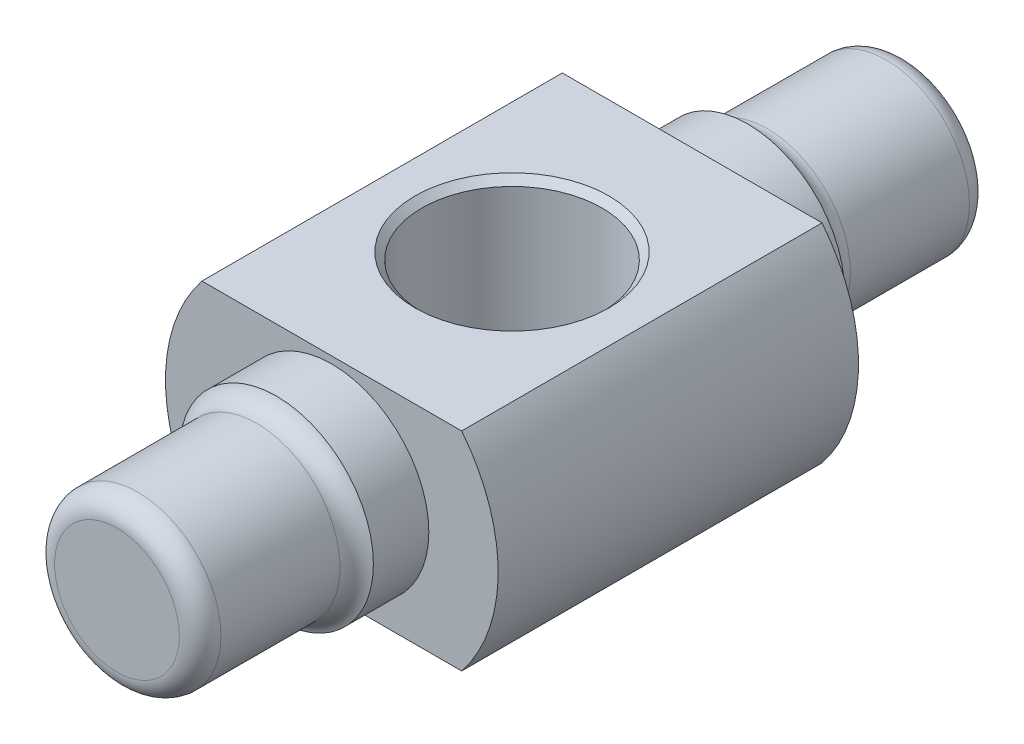
ISO-10303-21;
HEADER;
FILE_DESCRIPTION(('STEP AP214'),'2;1');
FILE_NAME('part.step','',(''),(''),'','','');
FILE_SCHEMA(('AUTOMOTIVE_DESIGN { 1 0 10303 214 1 1 1 1 }'));
ENDSEC;
DATA;
#1=APPLICATION_CONTEXT('core data for automotive mechanical design processes');
#2=APPLICATION_PROTOCOL_DEFINITION('international standard','automotive_design',2000,#1);
#3=PRODUCT_CONTEXT('',#1,'mechanical');
#4=PRODUCT('Part','Part','',(#3));
#5=PRODUCT_RELATED_PRODUCT_CATEGORY('part','',(#4));
#6=PRODUCT_DEFINITION_FORMATION('','',#4);
#7=PRODUCT_DEFINITION_CONTEXT('part definition',#1,'design');
#8=PRODUCT_DEFINITION('design','',#6,#7);
#9=PRODUCT_DEFINITION_SHAPE('','',#8);
#10=(LENGTH_UNIT() NAMED_UNIT(*) SI_UNIT(.MILLI.,.METRE.));
#11=(NAMED_UNIT(*) PLANE_ANGLE_UNIT() SI_UNIT($,.RADIAN.));
#12=(NAMED_UNIT(*) SI_UNIT($,.STERADIAN.) SOLID_ANGLE_UNIT());
#13=UNCERTAINTY_MEASURE_WITH_UNIT(LENGTH_MEASURE(1.E-05),#10,'distance_accuracy_value','');
#14=(GEOMETRIC_REPRESENTATION_CONTEXT(3) GLOBAL_UNCERTAINTY_ASSIGNED_CONTEXT((#13)) GLOBAL_UNIT_ASSIGNED_CONTEXT((#10,
#11,#12)) REPRESENTATION_CONTEXT('',''));
#15=CARTESIAN_POINT('',(0.,0.,0.));
#16=DIRECTION('',(0.,0.,1.));
#17=DIRECTION('',(1.,0.,0.));
#18=AXIS2_PLACEMENT_3D('',#15,#16,#17);
#19=CARTESIAN_POINT('',(0.,-7.5,26.));
#20=DIRECTION('',(0.,1.,0.));
#21=DIRECTION('',(0.,0.,1.));
#22=AXIS2_PLACEMENT_3D('',#19,#20,#21);
#23=PLANE('',#22);
#24=CARTESIAN_POINT('',(0.,-7.5,13.));
#25=DIRECTION('',(0.,1.,0.));
#26=DIRECTION('',(0.,0.,1.));
#27=AXIS2_PLACEMENT_3D('',#24,#25,#26);
#28=CIRCLE('',#27,6.99999999999999);
#29=CARTESIAN_POINT('',(0.,-7.5,20.));
#30=VERTEX_POINT('',#29);
#31=EDGE_CURVE('E133',#30,#30,#28,.T.);
#32=ORIENTED_EDGE('',*,*,#31,.T.);
#33=EDGE_LOOP('',(#32));
#34=FACE_BOUND('',#33,.T.);
#35=DIRECTION('',(1.,0.,0.));
#36=VECTOR('',#35,1.);
#37=CARTESIAN_POINT('',(0.,-7.5,0.));
#38=LINE('',#37,#36);
#39=CARTESIAN_POINT('',(-9.3674969975976,-7.5,0.));
#40=VERTEX_POINT('',#39);
#41=CARTESIAN_POINT('',(9.3674969975976,-7.5,0.));
#42=VERTEX_POINT('',#41);
#43=EDGE_CURVE('E115',#40,#42,#38,.T.);
#44=ORIENTED_EDGE('',*,*,#43,.T.);
#45=DIRECTION('',(0.,0.,-1.));
#46=VECTOR('',#45,1.);
#47=CARTESIAN_POINT('',(9.3674969975976,-7.5,26.));
#48=LINE('',#47,#46);
#49=CARTESIAN_POINT('',(9.3674969975976,-7.5,26.));
#50=VERTEX_POINT('',#49);
#51=EDGE_CURVE('E105',#50,#42,#48,.T.);
#52=ORIENTED_EDGE('',*,*,#51,.F.);
#53=DIRECTION('',(1.,0.,0.));
#54=VECTOR('',#53,1.);
#55=CARTESIAN_POINT('',(0.,-7.5,26.));
#56=LINE('',#55,#54);
#57=CARTESIAN_POINT('',(-9.3674969975976,-7.5,26.));
#58=VERTEX_POINT('',#57);
#59=EDGE_CURVE('E93',#58,#50,#56,.T.);
#60=ORIENTED_EDGE('',*,*,#59,.F.);
#61=DIRECTION('',(0.,0.,-1.));
#62=VECTOR('',#61,1.);
#63=CARTESIAN_POINT('',(-9.3674969975976,-7.5,26.));
#64=LINE('',#63,#62);
#65=EDGE_CURVE('E111',#58,#40,#64,.T.);
#66=ORIENTED_EDGE('',*,*,#65,.T.);
#67=EDGE_LOOP('',(#44,#52,#60,#66));
#68=FACE_BOUND('',#67,.T.);
#69=ADVANCED_FACE('F43',(#34,#68),#23,.F.);
#70=CARTESIAN_POINT('',(0.,0.,26.));
#71=DIRECTION('',(0.,0.,-1.));
#72=DIRECTION('',(-1.,0.,0.));
#73=AXIS2_PLACEMENT_3D('',#70,#71,#72);
#74=CYLINDRICAL_SURFACE('',#73,12.);
#75=CARTESIAN_POINT('',(0.,0.,0.));
#76=DIRECTION('',(0.,0.,1.));
#77=DIRECTION('',(1.,0.,0.));
#78=AXIS2_PLACEMENT_3D('',#75,#76,#77);
#79=CIRCLE('',#78,12.);
#80=CARTESIAN_POINT('',(9.3674969975976,7.5,0.));
#81=VERTEX_POINT('',#80);
#82=EDGE_CURVE('E100',#42,#81,#79,.T.);
#83=ORIENTED_EDGE('',*,*,#82,.T.);
#84=DIRECTION('',(0.,0.,-1.));
#85=VECTOR('',#84,1.);
#86=CARTESIAN_POINT('',(9.3674969975976,7.5,26.));
#87=LINE('',#86,#85);
#88=CARTESIAN_POINT('',(9.3674969975976,7.5,26.));
#89=VERTEX_POINT('',#88);
#90=EDGE_CURVE('E98',#89,#81,#87,.T.);
#91=ORIENTED_EDGE('',*,*,#90,.F.);
#92=CARTESIAN_POINT('',(0.,0.,26.));
#93=DIRECTION('',(0.,0.,1.));
#94=DIRECTION('',(1.,0.,0.));
#95=AXIS2_PLACEMENT_3D('',#92,#93,#94);
#96=CIRCLE('',#95,12.);
#97=EDGE_CURVE('E88',#50,#89,#96,.T.);
#98=ORIENTED_EDGE('',*,*,#97,.F.);
#99=ORIENTED_EDGE('',*,*,#51,.T.);
#100=EDGE_LOOP('',(#83,#91,#98,#99));
#101=FACE_BOUND('',#100,.T.);
#102=ADVANCED_FACE('F99',(#101),#74,.T.);
#103=CARTESIAN_POINT('',(0.,7.5,26.));
#104=DIRECTION('',(0.,1.,0.));
#105=DIRECTION('',(0.,0.,1.));
#106=AXIS2_PLACEMENT_3D('',#103,#104,#105);
#107=PLANE('',#106);
#108=CARTESIAN_POINT('',(0.,7.5,13.));
#109=DIRECTION('',(0.,1.,0.));
#110=DIRECTION('',(0.,0.,1.));
#111=AXIS2_PLACEMENT_3D('',#108,#109,#110);
#112=CIRCLE('',#111,7.);
#113=CARTESIAN_POINT('',(0.,7.5,20.));
#114=VERTEX_POINT('',#113);
#115=EDGE_CURVE('E145',#114,#114,#112,.F.);
#116=ORIENTED_EDGE('',*,*,#115,.T.);
#117=EDGE_LOOP('',(#116));
#118=FACE_BOUND('',#117,.T.);
#119=DIRECTION('',(1.,0.,0.));
#120=VECTOR('',#119,1.);
#121=CARTESIAN_POINT('',(0.,7.5,0.));
#122=LINE('',#121,#120);
#123=CARTESIAN_POINT('',(-9.3674969975976,7.5,0.));
#124=VERTEX_POINT('',#123);
#125=EDGE_CURVE('E122',#124,#81,#122,.T.);
#126=ORIENTED_EDGE('',*,*,#125,.F.);
#127=DIRECTION('',(0.,0.,-1.));
#128=VECTOR('',#127,1.);
#129=CARTESIAN_POINT('',(-9.3674969975976,7.5,26.));
#130=LINE('',#129,#128);
#131=CARTESIAN_POINT('',(-9.3674969975976,7.5,26.));
#132=VERTEX_POINT('',#131);
#133=EDGE_CURVE('E77',#132,#124,#130,.T.);
#134=ORIENTED_EDGE('',*,*,#133,.F.);
#135=DIRECTION('',(1.,0.,0.));
#136=VECTOR('',#135,1.);
#137=CARTESIAN_POINT('',(0.,7.5,26.));
#138=LINE('',#137,#136);
#139=EDGE_CURVE('E91',#132,#89,#138,.T.);
#140=ORIENTED_EDGE('',*,*,#139,.T.);
#141=ORIENTED_EDGE('',*,*,#90,.T.);
#142=EDGE_LOOP('',(#126,#134,#140,#141));
#143=FACE_BOUND('',#142,.T.);
#144=ADVANCED_FACE('F107',(#118,#143),#107,.T.);
#145=CARTESIAN_POINT('',(0.,0.,26.));
#146=DIRECTION('',(0.,0.,-1.));
#147=DIRECTION('',(-1.,0.,0.));
#148=AXIS2_PLACEMENT_3D('',#145,#146,#147);
#149=CYLINDRICAL_SURFACE('',#148,12.);
#150=CARTESIAN_POINT('',(0.,0.,0.));
#151=DIRECTION('',(0.,0.,1.));
#152=DIRECTION('',(1.,0.,0.));
#153=AXIS2_PLACEMENT_3D('',#150,#151,#152);
#154=CIRCLE('',#153,12.);
#155=EDGE_CURVE('E80',#124,#40,#154,.T.);
#156=ORIENTED_EDGE('',*,*,#155,.T.);
#157=ORIENTED_EDGE('',*,*,#65,.F.);
#158=CARTESIAN_POINT('',(0.,0.,26.));
#159=DIRECTION('',(0.,0.,1.));
#160=DIRECTION('',(1.,0.,0.));
#161=AXIS2_PLACEMENT_3D('',#158,#159,#160);
#162=CIRCLE('',#161,12.);
#163=EDGE_CURVE('E61',#132,#58,#162,.T.);
#164=ORIENTED_EDGE('',*,*,#163,.F.);
#165=ORIENTED_EDGE('',*,*,#133,.T.);
#166=EDGE_LOOP('',(#156,#157,#164,#165));
#167=FACE_BOUND('',#166,.T.);
#168=ADVANCED_FACE('F244',(#167),#149,.T.);
#169=CARTESIAN_POINT('',(0.,0.,26.));
#170=DIRECTION('',(0.,0.,1.));
#171=DIRECTION('',(1.,0.,0.));
#172=AXIS2_PLACEMENT_3D('',#169,#170,#171);
#173=PLANE('',#172);
#174=CARTESIAN_POINT('',(0.,0.,26.));
#175=DIRECTION('',(0.,0.,1.));
#176=DIRECTION('',(1.,0.,0.));
#177=AXIS2_PLACEMENT_3D('',#174,#175,#176);
#178=CIRCLE('',#177,7.);
#179=CARTESIAN_POINT('',(7.,0.,26.));
#180=VERTEX_POINT('',#179);
#181=EDGE_CURVE('E149',#180,#180,#178,.T.);
#182=ORIENTED_EDGE('',*,*,#181,.F.);
#183=EDGE_LOOP('',(#182));
#184=FACE_BOUND('',#183,.T.);
#185=ORIENTED_EDGE('',*,*,#59,.T.);
#186=ORIENTED_EDGE('',*,*,#97,.T.);
#187=ORIENTED_EDGE('',*,*,#139,.F.);
#188=ORIENTED_EDGE('',*,*,#163,.T.);
#189=EDGE_LOOP('',(#185,#186,#187,#188));
#190=FACE_BOUND('',#189,.T.);
#191=ADVANCED_FACE('F89',(#184,#190),#173,.T.);
#192=CARTESIAN_POINT('',(0.,0.,0.));
#193=DIRECTION('',(0.,0.,1.));
#194=DIRECTION('',(1.,0.,0.));
#195=AXIS2_PLACEMENT_3D('',#192,#193,#194);
#196=PLANE('',#195);
#197=CARTESIAN_POINT('',(0.,0.,0.));
#198=DIRECTION('',(0.,0.,1.));
#199=DIRECTION('',(1.,0.,0.));
#200=AXIS2_PLACEMENT_3D('',#197,#198,#199);
#201=CIRCLE('',#200,7.);
#202=CARTESIAN_POINT('',(7.,0.,0.));
#203=VERTEX_POINT('',#202);
#204=EDGE_CURVE('E381',#203,#203,#201,.T.);
#205=ORIENTED_EDGE('',*,*,#204,.T.);
#206=EDGE_LOOP('',(#205));
#207=FACE_BOUND('',#206,.T.);
#208=ORIENTED_EDGE('',*,*,#43,.F.);
#209=ORIENTED_EDGE('',*,*,#155,.F.);
#210=ORIENTED_EDGE('',*,*,#125,.T.);
#211=ORIENTED_EDGE('',*,*,#82,.F.);
#212=EDGE_LOOP('',(#208,#209,#210,#211));
#213=FACE_BOUND('',#212,.T.);
#214=ADVANCED_FACE('F240',(#207,#213),#196,.F.);
#215=CARTESIAN_POINT('',(0.,-7.5,13.));
#216=DIRECTION('',(0.,1.,0.));
#217=DIRECTION('',(0.,0.,1.));
#218=AXIS2_PLACEMENT_3D('',#215,#216,#217);
#219=CYLINDRICAL_SURFACE('',#218,6.5);
#220=CARTESIAN_POINT('',(0.,-7.00000000000001,13.));
#221=DIRECTION('',(0.,1.,0.));
#222=DIRECTION('',(0.,0.,1.));
#223=AXIS2_PLACEMENT_3D('',#220,#221,#222);
#224=CIRCLE('',#223,6.5);
#225=CARTESIAN_POINT('',(0.,-7.00000000000001,19.5));
#226=VERTEX_POINT('',#225);
#227=EDGE_CURVE('E141',#226,#226,#224,.F.);
#228=ORIENTED_EDGE('',*,*,#227,.T.);
#229=EDGE_LOOP('',(#228));
#230=FACE_BOUND('',#229,.T.);
#231=CARTESIAN_POINT('',(0.,7.,13.));
#232=DIRECTION('',(0.,1.,0.));
#233=DIRECTION('',(0.,0.,1.));
#234=AXIS2_PLACEMENT_3D('',#231,#232,#233);
#235=CIRCLE('',#234,6.5);
#236=CARTESIAN_POINT('',(0.,7.,19.5));
#237=VERTEX_POINT('',#236);
#238=EDGE_CURVE('E137',#237,#237,#235,.T.);
#239=ORIENTED_EDGE('',*,*,#238,.T.);
#240=EDGE_LOOP('',(#239));
#241=FACE_BOUND('',#240,.T.);
#242=ADVANCED_FACE('F201',(#230,#241),#219,.F.);
#243=CARTESIAN_POINT('',(0.,-7.5,13.));
#244=DIRECTION('',(0.,-1.,0.));
#245=DIRECTION('',(0.,0.,-1.));
#246=AXIS2_PLACEMENT_3D('',#243,#244,#245);
#247=CONICAL_SURFACE('',#246,6.99999999999999,0.785398163397446);
#248=ORIENTED_EDGE('',*,*,#227,.F.);
#249=EDGE_LOOP('',(#248));
#250=FACE_BOUND('',#249,.T.);
#251=ORIENTED_EDGE('',*,*,#31,.F.);
#252=EDGE_LOOP('',(#251));
#253=FACE_BOUND('',#252,.T.);
#254=ADVANCED_FACE('F197',(#250,#253),#247,.F.);
#255=CARTESIAN_POINT('',(0.,7.,13.));
#256=DIRECTION('',(0.,1.,0.));
#257=DIRECTION('',(0.,0.,1.));
#258=AXIS2_PLACEMENT_3D('',#255,#256,#257);
#259=CONICAL_SURFACE('',#258,6.5,0.78539816339745);
#260=ORIENTED_EDGE('',*,*,#115,.F.);
#261=EDGE_LOOP('',(#260));
#262=FACE_BOUND('',#261,.T.);
#263=ORIENTED_EDGE('',*,*,#238,.F.);
#264=EDGE_LOOP('',(#263));
#265=FACE_BOUND('',#264,.T.);
#266=ADVANCED_FACE('F200',(#262,#265),#259,.F.);
#267=CARTESIAN_POINT('',(0.,0.,30.));
#268=DIRECTION('',(0.,0.,-1.));
#269=DIRECTION('',(-1.,0.,0.));
#270=AXIS2_PLACEMENT_3D('',#267,#268,#269);
#271=CYLINDRICAL_SURFACE('',#270,7.);
#272=CARTESIAN_POINT('',(0.,0.,30.));
#273=DIRECTION('',(0.,0.,1.));
#274=DIRECTION('',(1.,0.,0.));
#275=AXIS2_PLACEMENT_3D('',#272,#273,#274);
#276=CIRCLE('',#275,7.);
#277=CARTESIAN_POINT('',(7.,0.,30.));
#278=VERTEX_POINT('',#277);
#279=EDGE_CURVE('E119',#278,#278,#276,.T.);
#280=ORIENTED_EDGE('',*,*,#279,.F.);
#281=EDGE_LOOP('',(#280));
#282=FACE_BOUND('',#281,.T.);
#283=ORIENTED_EDGE('',*,*,#181,.T.);
#284=EDGE_LOOP('',(#283));
#285=FACE_BOUND('',#284,.T.);
#286=ADVANCED_FACE('F205',(#282,#285),#271,.T.);
#287=CARTESIAN_POINT('',(0.,0.,41.5));
#288=DIRECTION('',(0.,0.,-1.));
#289=DIRECTION('',(-1.,0.,0.));
#290=AXIS2_PLACEMENT_3D('',#287,#288,#289);
#291=CYLINDRICAL_SURFACE('',#290,6.);
#292=CARTESIAN_POINT('',(0.,0.,40.));
#293=DIRECTION('',(0.,0.,1.));
#294=DIRECTION('',(1.,0.,0.));
#295=AXIS2_PLACEMENT_3D('',#292,#293,#294);
#296=CIRCLE('',#295,6.);
#297=CARTESIAN_POINT('',(6.,0.,40.));
#298=VERTEX_POINT('',#297);
#299=EDGE_CURVE('E158',#298,#298,#296,.F.);
#300=ORIENTED_EDGE('',*,*,#299,.T.);
#301=EDGE_LOOP('',(#300));
#302=FACE_BOUND('',#301,.T.);
#303=CARTESIAN_POINT('',(0.,0.,31.4142135623731));
#304=DIRECTION('',(0.,0.,-1.));
#305=DIRECTION('',(-1.,0.,0.));
#306=AXIS2_PLACEMENT_3D('',#303,#304,#305);
#307=CIRCLE('',#306,6.);
#308=CARTESIAN_POINT('',(-6.,0.,31.4142135623731));
#309=VERTEX_POINT('',#308);
#310=EDGE_CURVE('E154',#309,#309,#307,.F.);
#311=ORIENTED_EDGE('',*,*,#310,.T.);
#312=EDGE_LOOP('',(#311));
#313=FACE_BOUND('',#312,.T.);
#314=ADVANCED_FACE('F225',(#302,#313),#291,.T.);
#315=CARTESIAN_POINT('',(0.,0.,41.5));
#316=DIRECTION('',(0.,0.,1.));
#317=DIRECTION('',(1.,0.,0.));
#318=AXIS2_PLACEMENT_3D('',#315,#316,#317);
#319=PLANE('',#318);
#320=CARTESIAN_POINT('',(0.,0.,41.5));
#321=DIRECTION('',(0.,0.,1.));
#322=DIRECTION('',(1.,0.,0.));
#323=AXIS2_PLACEMENT_3D('',#320,#321,#322);
#324=CIRCLE('',#323,4.5);
#325=CARTESIAN_POINT('',(4.5,0.,41.5));
#326=VERTEX_POINT('',#325);
#327=EDGE_CURVE('E150',#326,#326,#324,.T.);
#328=ORIENTED_EDGE('',*,*,#327,.T.);
#329=EDGE_LOOP('',(#328));
#330=FACE_BOUND('',#329,.T.);
#331=ADVANCED_FACE('F210',(#330),#319,.T.);
#332=CARTESIAN_POINT('',(0.,0.,40.));
#333=DIRECTION('',(0.,0.,1.));
#334=DIRECTION('',(1.,0.,0.));
#335=AXIS2_PLACEMENT_3D('',#332,#333,#334);
#336=TOROIDAL_SURFACE('',#335,4.5,1.5);
#337=ORIENTED_EDGE('',*,*,#299,.F.);
#338=EDGE_LOOP('',(#337));
#339=FACE_BOUND('',#338,.T.);
#340=ORIENTED_EDGE('',*,*,#327,.F.);
#341=EDGE_LOOP('',(#340));
#342=FACE_BOUND('',#341,.T.);
#343=ADVANCED_FACE('F207',(#339,#342),#336,.T.);
#344=CARTESIAN_POINT('',(0.,0.,31.4142135623731));
#345=DIRECTION('',(0.,0.,-1.));
#346=DIRECTION('',(-1.,0.,0.));
#347=AXIS2_PLACEMENT_3D('',#344,#345,#346);
#348=TOROIDAL_SURFACE('',#347,7.5,1.5);
#349=ORIENTED_EDGE('',*,*,#279,.T.);
#350=EDGE_LOOP('',(#349));
#351=FACE_BOUND('',#350,.T.);
#352=ORIENTED_EDGE('',*,*,#310,.F.);
#353=EDGE_LOOP('',(#352));
#354=FACE_BOUND('',#353,.T.);
#355=ADVANCED_FACE('F209',(#351,#354),#348,.F.);
#356=CARTESIAN_POINT('',(0.,0.,-4.));
#357=DIRECTION('',(0.,0.,1.));
#358=DIRECTION('',(1.,0.,0.));
#359=AXIS2_PLACEMENT_3D('',#356,#357,#358);
#360=CYLINDRICAL_SURFACE('',#359,7.);
#361=CARTESIAN_POINT('',(0.,0.,-4.));
#362=DIRECTION('',(0.,0.,1.));
#363=DIRECTION('',(1.,0.,0.));
#364=AXIS2_PLACEMENT_3D('',#361,#362,#363);
#365=CIRCLE('',#364,7.);
#366=CARTESIAN_POINT('',(7.,0.,-4.));
#367=VERTEX_POINT('',#366);
#368=EDGE_CURVE('E390',#367,#367,#365,.T.);
#369=ORIENTED_EDGE('',*,*,#368,.T.);
#370=EDGE_LOOP('',(#369));
#371=FACE_BOUND('',#370,.T.);
#372=ORIENTED_EDGE('',*,*,#204,.F.);
#373=EDGE_LOOP('',(#372));
#374=FACE_BOUND('',#373,.T.);
#375=ADVANCED_FACE('F213',(#371,#374),#360,.T.);
#376=CARTESIAN_POINT('',(0.,0.,-15.5));
#377=DIRECTION('',(0.,0.,1.));
#378=DIRECTION('',(1.,0.,0.));
#379=AXIS2_PLACEMENT_3D('',#376,#377,#378);
#380=CYLINDRICAL_SURFACE('',#379,6.);
#381=CARTESIAN_POINT('',(0.,0.,-14.));
#382=DIRECTION('',(0.,0.,-1.));
#383=DIRECTION('',(-1.,0.,0.));
#384=AXIS2_PLACEMENT_3D('',#381,#382,#383);
#385=CIRCLE('',#384,6.);
#386=CARTESIAN_POINT('',(-6.,0.,-14.));
#387=VERTEX_POINT('',#386);
#388=EDGE_CURVE('E53',#387,#387,#385,.F.);
#389=ORIENTED_EDGE('',*,*,#388,.T.);
#390=EDGE_LOOP('',(#389));
#391=FACE_BOUND('',#390,.T.);
#392=CARTESIAN_POINT('',(0.,0.,-5.41421356237309));
#393=DIRECTION('',(0.,0.,1.));
#394=DIRECTION('',(1.,0.,0.));
#395=AXIS2_PLACEMENT_3D('',#392,#393,#394);
#396=CIRCLE('',#395,6.);
#397=CARTESIAN_POINT('',(6.,0.,-5.41421356237309));
#398=VERTEX_POINT('',#397);
#399=EDGE_CURVE('E162',#398,#398,#396,.F.);
#400=ORIENTED_EDGE('',*,*,#399,.T.);
#401=EDGE_LOOP('',(#400));
#402=FACE_BOUND('',#401,.T.);
#403=ADVANCED_FACE('F169',(#391,#402),#380,.T.);
#404=CARTESIAN_POINT('',(0.,0.,-15.5));
#405=DIRECTION('',(0.,0.,-1.));
#406=DIRECTION('',(1.,0.,0.));
#407=AXIS2_PLACEMENT_3D('',#404,#405,#406);
#408=PLANE('',#407);
#409=CARTESIAN_POINT('',(0.,0.,-15.5));
#410=DIRECTION('',(0.,0.,-1.));
#411=DIRECTION('',(-1.,0.,0.));
#412=AXIS2_PLACEMENT_3D('',#409,#410,#411);
#413=CIRCLE('',#412,4.5);
#414=CARTESIAN_POINT('',(-4.5,0.,-15.5));
#415=VERTEX_POINT('',#414);
#416=EDGE_CURVE('E11',#415,#415,#413,.T.);
#417=ORIENTED_EDGE('',*,*,#416,.T.);
#418=EDGE_LOOP('',(#417));
#419=FACE_BOUND('',#418,.T.);
#420=ADVANCED_FACE('F174',(#419),#408,.T.);
#421=CARTESIAN_POINT('',(0.,0.,-14.));
#422=DIRECTION('',(0.,0.,-1.));
#423=DIRECTION('',(-1.,0.,0.));
#424=AXIS2_PLACEMENT_3D('',#421,#422,#423);
#425=TOROIDAL_SURFACE('',#424,4.5,1.5);
#426=ORIENTED_EDGE('',*,*,#416,.F.);
#427=EDGE_LOOP('',(#426));
#428=FACE_BOUND('',#427,.T.);
#429=ORIENTED_EDGE('',*,*,#388,.F.);
#430=EDGE_LOOP('',(#429));
#431=FACE_BOUND('',#430,.T.);
#432=ADVANCED_FACE('F172',(#428,#431),#425,.T.);
#433=CARTESIAN_POINT('',(0.,0.,-5.41421356237309));
#434=DIRECTION('',(0.,0.,1.));
#435=DIRECTION('',(1.,0.,0.));
#436=AXIS2_PLACEMENT_3D('',#433,#434,#435);
#437=TOROIDAL_SURFACE('',#436,7.5,1.5);
#438=ORIENTED_EDGE('',*,*,#399,.F.);
#439=EDGE_LOOP('',(#438));
#440=FACE_BOUND('',#439,.T.);
#441=ORIENTED_EDGE('',*,*,#368,.F.);
#442=EDGE_LOOP('',(#441));
#443=FACE_BOUND('',#442,.T.);
#444=ADVANCED_FACE('F45',(#440,#443),#437,.F.);
#445=CLOSED_SHELL('',(#69,#102,#144,#168,#191,#214,#242,#254,#266,#286,#314,#331,#343,#355,#375,
#403,#420,#432,#444));
#446=MANIFOLD_SOLID_BREP('B2',#445);
#447=ADVANCED_BREP_SHAPE_REPRESENTATION('',(#18,#446),#14);
#448=SHAPE_DEFINITION_REPRESENTATION(#9,#447);
ENDSEC;
END-ISO-10303-21;
